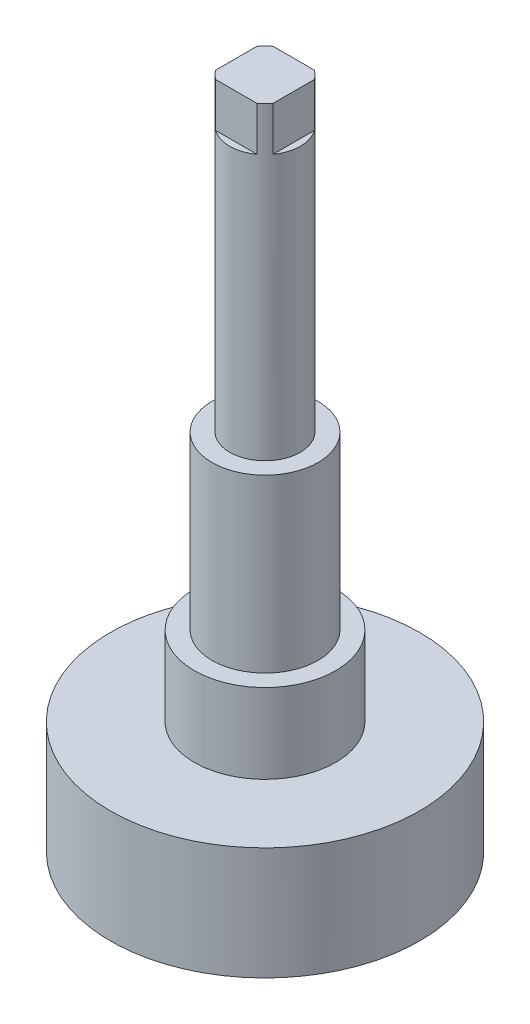
ISO-10303-21;
HEADER;
FILE_DESCRIPTION(('STEP AP214'),'2;1');
FILE_NAME('part.step','',(''),(''),'','','');
FILE_SCHEMA(('AUTOMOTIVE_DESIGN { 1 0 10303 214 1 1 1 1 }'));
ENDSEC;
DATA;
#1=APPLICATION_CONTEXT('core data for automotive mechanical design processes');
#2=APPLICATION_PROTOCOL_DEFINITION('international standard','automotive_design',2000,#1);
#3=PRODUCT_CONTEXT('',#1,'mechanical');
#4=PRODUCT('Part','Part','',(#3));
#5=PRODUCT_RELATED_PRODUCT_CATEGORY('part','',(#4));
#6=PRODUCT_DEFINITION_FORMATION('','',#4);
#7=PRODUCT_DEFINITION_CONTEXT('part definition',#1,'design');
#8=PRODUCT_DEFINITION('design','',#6,#7);
#9=PRODUCT_DEFINITION_SHAPE('','',#8);
#10=(LENGTH_UNIT() NAMED_UNIT(*) SI_UNIT(.MILLI.,.METRE.));
#11=(NAMED_UNIT(*) PLANE_ANGLE_UNIT() SI_UNIT($,.RADIAN.));
#12=(NAMED_UNIT(*) SI_UNIT($,.STERADIAN.) SOLID_ANGLE_UNIT());
#13=UNCERTAINTY_MEASURE_WITH_UNIT(LENGTH_MEASURE(1.E-05),#10,'distance_accuracy_value','');
#14=(GEOMETRIC_REPRESENTATION_CONTEXT(3) GLOBAL_UNCERTAINTY_ASSIGNED_CONTEXT((#13)) GLOBAL_UNIT_ASSIGNED_CONTEXT((#10,
#11,#12)) REPRESENTATION_CONTEXT('',''));
#15=CARTESIAN_POINT('',(0.,0.,0.));
#16=DIRECTION('',(0.,0.,1.));
#17=DIRECTION('',(1.,0.,0.));
#18=AXIS2_PLACEMENT_3D('',#15,#16,#17);
#19=CARTESIAN_POINT('',(0.,63.4,0.));
#20=DIRECTION('',(0.,1.,0.));
#21=DIRECTION('',(0.,0.,1.));
#22=AXIS2_PLACEMENT_3D('',#19,#20,#21);
#23=PLANE('',#22);
#24=DIRECTION('',(-1.,0.,0.));
#25=VECTOR('',#24,1.);
#26=CARTESIAN_POINT('',(2.3318447632722,63.4,-3.25));
#27=LINE('',#26,#25);
#28=CARTESIAN_POINT('',(2.3318447632722,63.4,-3.25));
#29=VERTEX_POINT('',#28);
#30=CARTESIAN_POINT('',(-2.3318447632722,63.4,-3.25));
#31=VERTEX_POINT('',#30);
#32=EDGE_CURVE('E120',#29,#31,#27,.T.);
#33=ORIENTED_EDGE('',*,*,#32,.F.);
#34=CARTESIAN_POINT('',(0.,63.4,0.));
#35=DIRECTION('',(0.,1.,0.));
#36=DIRECTION('',(0.,0.,1.));
#37=AXIS2_PLACEMENT_3D('',#34,#35,#36);
#38=CIRCLE('',#37,4.);
#39=EDGE_CURVE('E361',#29,#31,#38,.T.);
#40=ORIENTED_EDGE('',*,*,#39,.T.);
#41=EDGE_LOOP('',(#33,#40));
#42=FACE_BOUND('',#41,.T.);
#43=ADVANCED_FACE('F34',(#42),#23,.T.);
#44=DIRECTION('',(0.,0.,-1.));
#45=VECTOR('',#44,1.);
#46=CARTESIAN_POINT('',(3.25,63.4,2.3318447632722));
#47=LINE('',#46,#45);
#48=CARTESIAN_POINT('',(3.25,63.4,2.3318447632722));
#49=VERTEX_POINT('',#48);
#50=CARTESIAN_POINT('',(3.25,63.4,-2.3318447632722));
#51=VERTEX_POINT('',#50);
#52=EDGE_CURVE('E359',#49,#51,#47,.T.);
#53=ORIENTED_EDGE('',*,*,#52,.F.);
#54=EDGE_CURVE('E143',#49,#51,#38,.T.);
#55=ORIENTED_EDGE('',*,*,#54,.T.);
#56=EDGE_LOOP('',(#53,#55));
#57=FACE_BOUND('',#56,.T.);
#58=ADVANCED_FACE('F174',(#57),#23,.T.);
#59=DIRECTION('',(1.,0.,0.));
#60=VECTOR('',#59,1.);
#61=CARTESIAN_POINT('',(-2.3318447632722,63.4,3.25));
#62=LINE('',#61,#60);
#63=CARTESIAN_POINT('',(-2.3318447632722,63.4,3.25));
#64=VERTEX_POINT('',#63);
#65=CARTESIAN_POINT('',(2.3318447632722,63.4,3.25));
#66=VERTEX_POINT('',#65);
#67=EDGE_CURVE('E50',#64,#66,#62,.T.);
#68=ORIENTED_EDGE('',*,*,#67,.F.);
#69=EDGE_CURVE('E137',#64,#66,#38,.T.);
#70=ORIENTED_EDGE('',*,*,#69,.T.);
#71=EDGE_LOOP('',(#68,#70));
#72=FACE_BOUND('',#71,.T.);
#73=ADVANCED_FACE('F181',(#72),#23,.T.);
#74=CARTESIAN_POINT('',(0.,5.,0.));
#75=DIRECTION('',(0.,1.,0.));
#76=DIRECTION('',(0.,0.,1.));
#77=AXIS2_PLACEMENT_3D('',#74,#75,#76);
#78=PLANE('',#77);
#79=CARTESIAN_POINT('',(0.,5.,0.));
#80=DIRECTION('',(0.,1.,0.));
#81=DIRECTION('',(0.,0.,1.));
#82=AXIS2_PLACEMENT_3D('',#79,#80,#81);
#83=CIRCLE('',#82,17.5);
#84=CARTESIAN_POINT('',(0.,5.,17.5));
#85=VERTEX_POINT('',#84);
#86=EDGE_CURVE('E154',#85,#85,#83,.T.);
#87=ORIENTED_EDGE('',*,*,#86,.T.);
#88=EDGE_LOOP('',(#87));
#89=FACE_BOUND('',#88,.T.);
#90=CARTESIAN_POINT('',(0.,5.,0.));
#91=DIRECTION('',(0.,1.,0.));
#92=DIRECTION('',(0.,0.,1.));
#93=AXIS2_PLACEMENT_3D('',#90,#91,#92);
#94=CIRCLE('',#93,8.);
#95=CARTESIAN_POINT('',(0.,5.,8.));
#96=VERTEX_POINT('',#95);
#97=EDGE_CURVE('E128',#96,#96,#94,.T.);
#98=ORIENTED_EDGE('',*,*,#97,.F.);
#99=EDGE_LOOP('',(#98));
#100=FACE_BOUND('',#99,.T.);
#101=ADVANCED_FACE('F171',(#89,#100),#78,.T.);
#102=CARTESIAN_POINT('',(0.,0.,0.));
#103=DIRECTION('',(0.,1.,0.));
#104=DIRECTION('',(0.,0.,1.));
#105=AXIS2_PLACEMENT_3D('',#102,#103,#104);
#106=PLANE('',#105);
#107=CARTESIAN_POINT('',(0.,0.,0.));
#108=DIRECTION('',(0.,1.,0.));
#109=DIRECTION('',(0.,0.,1.));
#110=AXIS2_PLACEMENT_3D('',#107,#108,#109);
#111=CIRCLE('',#110,5.);
#112=CARTESIAN_POINT('',(0.,0.,5.));
#113=VERTEX_POINT('',#112);
#114=EDGE_CURVE('E43',#113,#113,#111,.T.);
#115=ORIENTED_EDGE('',*,*,#114,.T.);
#116=EDGE_LOOP('',(#115));
#117=FACE_BOUND('',#116,.T.);
#118=CARTESIAN_POINT('',(0.,0.,0.));
#119=DIRECTION('',(0.,-1.,0.));
#120=DIRECTION('',(0.,0.,-1.));
#121=AXIS2_PLACEMENT_3D('',#118,#119,#120);
#122=CIRCLE('',#121,13.5);
#123=CARTESIAN_POINT('',(0.,0.,-13.5));
#124=VERTEX_POINT('',#123);
#125=EDGE_CURVE('E149',#124,#124,#122,.T.);
#126=ORIENTED_EDGE('',*,*,#125,.T.);
#127=EDGE_LOOP('',(#126));
#128=FACE_BOUND('',#127,.T.);
#129=ADVANCED_FACE('F159',(#117,#128),#106,.F.);
#130=CARTESIAN_POINT('',(0.,-8.,0.));
#131=DIRECTION('',(0.,1.,0.));
#132=DIRECTION('',(0.,0.,1.));
#133=AXIS2_PLACEMENT_3D('',#130,#131,#132);
#134=CYLINDRICAL_SURFACE('',#133,5.);
#135=CARTESIAN_POINT('',(0.,-8.,0.));
#136=DIRECTION('',(0.,1.,0.));
#137=DIRECTION('',(0.,0.,1.));
#138=AXIS2_PLACEMENT_3D('',#135,#136,#137);
#139=CIRCLE('',#138,5.);
#140=CARTESIAN_POINT('',(0.,-8.,5.));
#141=VERTEX_POINT('',#140);
#142=EDGE_CURVE('E11',#141,#141,#139,.T.);
#143=ORIENTED_EDGE('',*,*,#142,.T.);
#144=EDGE_LOOP('',(#143));
#145=FACE_BOUND('',#144,.T.);
#146=ORIENTED_EDGE('',*,*,#114,.F.);
#147=EDGE_LOOP('',(#146));
#148=FACE_BOUND('',#147,.T.);
#149=ADVANCED_FACE('F36',(#145,#148),#134,.T.);
#150=CARTESIAN_POINT('',(0.,-8.,0.));
#151=DIRECTION('',(0.,1.,0.));
#152=DIRECTION('',(0.,0.,1.));
#153=AXIS2_PLACEMENT_3D('',#150,#151,#152);
#154=PLANE('',#153);
#155=ORIENTED_EDGE('',*,*,#142,.F.);
#156=EDGE_LOOP('',(#155));
#157=FACE_BOUND('',#156,.T.);
#158=ADVANCED_FACE('F163',(#157),#154,.F.);
#159=CARTESIAN_POINT('',(0.,-7.75,0.));
#160=DIRECTION('',(0.,-1.,0.));
#161=DIRECTION('',(0.,0.,-1.));
#162=AXIS2_PLACEMENT_3D('',#159,#160,#161);
#163=PLANE('',#162);
#164=CARTESIAN_POINT('',(0.,-7.75,0.));
#165=DIRECTION('',(0.,-1.,0.));
#166=DIRECTION('',(0.,0.,-1.));
#167=AXIS2_PLACEMENT_3D('',#164,#165,#166);
#168=CIRCLE('',#167,17.5);
#169=CARTESIAN_POINT('',(0.,-7.75,-17.5));
#170=VERTEX_POINT('',#169);
#171=EDGE_CURVE('E148',#170,#170,#168,.T.);
#172=ORIENTED_EDGE('',*,*,#171,.T.);
#173=EDGE_LOOP('',(#172));
#174=FACE_BOUND('',#173,.T.);
#175=CARTESIAN_POINT('',(0.,-7.75,0.));
#176=DIRECTION('',(0.,-1.,0.));
#177=DIRECTION('',(0.,0.,-1.));
#178=AXIS2_PLACEMENT_3D('',#175,#176,#177);
#179=CIRCLE('',#178,13.5);
#180=CARTESIAN_POINT('',(0.,-7.75,-13.5));
#181=VERTEX_POINT('',#180);
#182=EDGE_CURVE('E145',#181,#181,#179,.T.);
#183=ORIENTED_EDGE('',*,*,#182,.F.);
#184=EDGE_LOOP('',(#183));
#185=FACE_BOUND('',#184,.T.);
#186=ADVANCED_FACE('F169',(#174,#185),#163,.T.);
#187=CARTESIAN_POINT('',(0.,-7.75,0.));
#188=DIRECTION('',(0.,1.,0.));
#189=DIRECTION('',(0.,0.,1.));
#190=AXIS2_PLACEMENT_3D('',#187,#188,#189);
#191=CYLINDRICAL_SURFACE('',#190,13.5);
#192=ORIENTED_EDGE('',*,*,#182,.T.);
#193=EDGE_LOOP('',(#192));
#194=FACE_BOUND('',#193,.T.);
#195=ORIENTED_EDGE('',*,*,#125,.F.);
#196=EDGE_LOOP('',(#195));
#197=FACE_BOUND('',#196,.T.);
#198=ADVANCED_FACE('F211',(#194,#197),#191,.F.);
#199=CARTESIAN_POINT('',(0.,5.,0.));
#200=DIRECTION('',(0.,-1.,0.));
#201=DIRECTION('',(0.,0.,-1.));
#202=AXIS2_PLACEMENT_3D('',#199,#200,#201);
#203=CYLINDRICAL_SURFACE('',#202,17.5);
#204=ORIENTED_EDGE('',*,*,#86,.F.);
#205=EDGE_LOOP('',(#204));
#206=FACE_BOUND('',#205,.T.);
#207=ORIENTED_EDGE('',*,*,#171,.F.);
#208=EDGE_LOOP('',(#207));
#209=FACE_BOUND('',#208,.T.);
#210=ADVANCED_FACE('F209',(#206,#209),#203,.T.);
#211=CARTESIAN_POINT('',(0.,14.,0.));
#212=DIRECTION('',(0.,1.,0.));
#213=DIRECTION('',(0.,0.,1.));
#214=AXIS2_PLACEMENT_3D('',#211,#212,#213);
#215=PLANE('',#214);
#216=CARTESIAN_POINT('',(0.,14.,0.));
#217=DIRECTION('',(0.,1.,0.));
#218=DIRECTION('',(0.,0.,1.));
#219=AXIS2_PLACEMENT_3D('',#216,#217,#218);
#220=CIRCLE('',#219,8.);
#221=CARTESIAN_POINT('',(0.,14.,8.));
#222=VERTEX_POINT('',#221);
#223=EDGE_CURVE('E134',#222,#222,#220,.T.);
#224=ORIENTED_EDGE('',*,*,#223,.T.);
#225=EDGE_LOOP('',(#224));
#226=FACE_BOUND('',#225,.T.);
#227=CARTESIAN_POINT('',(0.,14.,0.));
#228=DIRECTION('',(0.,1.,0.));
#229=DIRECTION('',(0.,0.,1.));
#230=AXIS2_PLACEMENT_3D('',#227,#228,#229);
#231=CIRCLE('',#230,6.);
#232=CARTESIAN_POINT('',(0.,14.,6.));
#233=VERTEX_POINT('',#232);
#234=EDGE_CURVE('E125',#233,#233,#231,.T.);
#235=ORIENTED_EDGE('',*,*,#234,.F.);
#236=EDGE_LOOP('',(#235));
#237=FACE_BOUND('',#236,.T.);
#238=ADVANCED_FACE('F194',(#226,#237),#215,.T.);
#239=CARTESIAN_POINT('',(0.,14.,0.));
#240=DIRECTION('',(0.,-1.,0.));
#241=DIRECTION('',(0.,0.,-1.));
#242=AXIS2_PLACEMENT_3D('',#239,#240,#241);
#243=CYLINDRICAL_SURFACE('',#242,8.);
#244=ORIENTED_EDGE('',*,*,#223,.F.);
#245=EDGE_LOOP('',(#244));
#246=FACE_BOUND('',#245,.T.);
#247=ORIENTED_EDGE('',*,*,#97,.T.);
#248=EDGE_LOOP('',(#247));
#249=FACE_BOUND('',#248,.T.);
#250=ADVANCED_FACE('F186',(#246,#249),#243,.T.);
#251=DIRECTION('',(0.,0.,1.));
#252=VECTOR('',#251,1.);
#253=CARTESIAN_POINT('',(-3.25,63.4,-2.3318447632722));
#254=LINE('',#253,#252);
#255=CARTESIAN_POINT('',(-3.25,63.4,-2.3318447632722));
#256=VERTEX_POINT('',#255);
#257=CARTESIAN_POINT('',(-3.25,63.4,2.3318447632722));
#258=VERTEX_POINT('',#257);
#259=EDGE_CURVE('E57',#256,#258,#254,.T.);
#260=ORIENTED_EDGE('',*,*,#259,.F.);
#261=EDGE_CURVE('E124',#256,#258,#38,.T.);
#262=ORIENTED_EDGE('',*,*,#261,.T.);
#263=EDGE_LOOP('',(#260,#262));
#264=FACE_BOUND('',#263,.T.);
#265=ADVANCED_FACE('F177',(#264),#23,.T.);
#266=CARTESIAN_POINT('',(0.,33.4,0.));
#267=DIRECTION('',(0.,1.,0.));
#268=DIRECTION('',(0.,0.,1.));
#269=AXIS2_PLACEMENT_3D('',#266,#267,#268);
#270=CYLINDRICAL_SURFACE('',#269,4.);
#271=CARTESIAN_POINT('',(0.,33.4,0.));
#272=DIRECTION('',(0.,1.,0.));
#273=DIRECTION('',(0.,0.,1.));
#274=AXIS2_PLACEMENT_3D('',#271,#272,#273);
#275=CIRCLE('',#274,4.);
#276=CARTESIAN_POINT('',(0.,33.4,4.));
#277=VERTEX_POINT('',#276);
#278=EDGE_CURVE('E140',#277,#277,#275,.T.);
#279=ORIENTED_EDGE('',*,*,#278,.T.);
#280=EDGE_LOOP('',(#279));
#281=FACE_BOUND('',#280,.T.);
#282=ORIENTED_EDGE('',*,*,#54,.F.);
#283=DIRECTION('',(0.,-1.,0.));
#284=VECTOR('',#283,1.);
#285=CARTESIAN_POINT('',(3.25,68.4,2.3318447632722));
#286=LINE('',#285,#284);
#287=CARTESIAN_POINT('',(3.25,68.4,2.3318447632722));
#288=VERTEX_POINT('',#287);
#289=EDGE_CURVE('E371',#288,#49,#286,.T.);
#290=ORIENTED_EDGE('',*,*,#289,.F.);
#291=CARTESIAN_POINT('',(0.,68.4,0.));
#292=DIRECTION('',(0.,1.,0.));
#293=DIRECTION('',(0.,0.,1.));
#294=AXIS2_PLACEMENT_3D('',#291,#292,#293);
#295=CIRCLE('',#294,4.);
#296=CARTESIAN_POINT('',(2.3318447632722,68.4,3.25));
#297=VERTEX_POINT('',#296);
#298=EDGE_CURVE('E383',#297,#288,#295,.T.);
#299=ORIENTED_EDGE('',*,*,#298,.F.);
#300=DIRECTION('',(0.,-1.,0.));
#301=VECTOR('',#300,1.);
#302=CARTESIAN_POINT('',(2.3318447632722,68.4,3.25));
#303=LINE('',#302,#301);
#304=EDGE_CURVE('E374',#297,#66,#303,.T.);
#305=ORIENTED_EDGE('',*,*,#304,.T.);
#306=ORIENTED_EDGE('',*,*,#69,.F.);
#307=DIRECTION('',(0.,-1.,0.));
#308=VECTOR('',#307,1.);
#309=CARTESIAN_POINT('',(-2.33184476327221,68.4,3.25));
#310=LINE('',#309,#308);
#311=CARTESIAN_POINT('',(-2.33184476327221,68.4,3.25));
#312=VERTEX_POINT('',#311);
#313=EDGE_CURVE('E130',#312,#64,#310,.T.);
#314=ORIENTED_EDGE('',*,*,#313,.F.);
#315=CARTESIAN_POINT('',(0.,68.4,0.));
#316=DIRECTION('',(0.,1.,0.));
#317=DIRECTION('',(0.,0.,1.));
#318=AXIS2_PLACEMENT_3D('',#315,#316,#317);
#319=CIRCLE('',#318,4.);
#320=CARTESIAN_POINT('',(-3.25,68.4,2.3318447632722));
#321=VERTEX_POINT('',#320);
#322=EDGE_CURVE('E110',#321,#312,#319,.T.);
#323=ORIENTED_EDGE('',*,*,#322,.F.);
#324=DIRECTION('',(0.,-1.,0.));
#325=VECTOR('',#324,1.);
#326=CARTESIAN_POINT('',(-3.25,68.4,2.3318447632722));
#327=LINE('',#326,#325);
#328=EDGE_CURVE('E107',#321,#258,#327,.T.);
#329=ORIENTED_EDGE('',*,*,#328,.T.);
#330=ORIENTED_EDGE('',*,*,#261,.F.);
#331=DIRECTION('',(0.,-1.,0.));
#332=VECTOR('',#331,1.);
#333=CARTESIAN_POINT('',(-3.25,68.4,-2.3318447632722));
#334=LINE('',#333,#332);
#335=CARTESIAN_POINT('',(-3.25,68.4,-2.3318447632722));
#336=VERTEX_POINT('',#335);
#337=EDGE_CURVE('E105',#336,#256,#334,.T.);
#338=ORIENTED_EDGE('',*,*,#337,.F.);
#339=CARTESIAN_POINT('',(0.,68.4,0.));
#340=DIRECTION('',(0.,1.,0.));
#341=DIRECTION('',(0.,0.,1.));
#342=AXIS2_PLACEMENT_3D('',#339,#340,#341);
#343=CIRCLE('',#342,4.);
#344=CARTESIAN_POINT('',(-2.3318447632722,68.4,-3.25));
#345=VERTEX_POINT('',#344);
#346=EDGE_CURVE('E111',#345,#336,#343,.T.);
#347=ORIENTED_EDGE('',*,*,#346,.F.);
#348=DIRECTION('',(0.,-1.,0.));
#349=VECTOR('',#348,1.);
#350=CARTESIAN_POINT('',(-2.3318447632722,68.4,-3.25));
#351=LINE('',#350,#349);
#352=EDGE_CURVE('E355',#345,#31,#351,.T.);
#353=ORIENTED_EDGE('',*,*,#352,.T.);
#354=ORIENTED_EDGE('',*,*,#39,.F.);
#355=DIRECTION('',(0.,-1.,0.));
#356=VECTOR('',#355,1.);
#357=CARTESIAN_POINT('',(2.3318447632722,68.4,-3.25));
#358=LINE('',#357,#356);
#359=CARTESIAN_POINT('',(2.3318447632722,68.4,-3.25));
#360=VERTEX_POINT('',#359);
#361=EDGE_CURVE('E357',#360,#29,#358,.T.);
#362=ORIENTED_EDGE('',*,*,#361,.F.);
#363=CARTESIAN_POINT('',(0.,68.4,0.));
#364=DIRECTION('',(0.,1.,0.));
#365=DIRECTION('',(0.,0.,1.));
#366=AXIS2_PLACEMENT_3D('',#363,#364,#365);
#367=CIRCLE('',#366,4.);
#368=CARTESIAN_POINT('',(3.25,68.4,-2.3318447632722));
#369=VERTEX_POINT('',#368);
#370=EDGE_CURVE('E365',#369,#360,#367,.T.);
#371=ORIENTED_EDGE('',*,*,#370,.F.);
#372=DIRECTION('',(0.,-1.,0.));
#373=VECTOR('',#372,1.);
#374=CARTESIAN_POINT('',(3.25,68.4,-2.3318447632722));
#375=LINE('',#374,#373);
#376=EDGE_CURVE('E363',#369,#51,#375,.T.);
#377=ORIENTED_EDGE('',*,*,#376,.T.);
#378=EDGE_LOOP('',(#282,#290,#299,#305,#306,#314,#323,#329,#330,#338,#347,#353,#354,#362,#371,#377));
#379=FACE_BOUND('',#378,.T.);
#380=ADVANCED_FACE('F123',(#281,#379),#270,.T.);
#381=CARTESIAN_POINT('',(0.,33.4,0.));
#382=DIRECTION('',(0.,1.,0.));
#383=DIRECTION('',(0.,0.,1.));
#384=AXIS2_PLACEMENT_3D('',#381,#382,#383);
#385=PLANE('',#384);
#386=ORIENTED_EDGE('',*,*,#278,.F.);
#387=EDGE_LOOP('',(#386));
#388=FACE_BOUND('',#387,.T.);
#389=CARTESIAN_POINT('',(0.,33.4,0.));
#390=DIRECTION('',(0.,1.,0.));
#391=DIRECTION('',(0.,0.,1.));
#392=AXIS2_PLACEMENT_3D('',#389,#390,#391);
#393=CIRCLE('',#392,6.);
#394=CARTESIAN_POINT('',(0.,33.4,6.));
#395=VERTEX_POINT('',#394);
#396=EDGE_CURVE('E38',#395,#395,#393,.T.);
#397=ORIENTED_EDGE('',*,*,#396,.T.);
#398=EDGE_LOOP('',(#397));
#399=FACE_BOUND('',#398,.T.);
#400=ADVANCED_FACE('F191',(#388,#399),#385,.T.);
#401=CARTESIAN_POINT('',(0.,63.4,0.));
#402=DIRECTION('',(0.,-1.,0.));
#403=DIRECTION('',(0.,0.,-1.));
#404=AXIS2_PLACEMENT_3D('',#401,#402,#403);
#405=CYLINDRICAL_SURFACE('',#404,6.);
#406=ORIENTED_EDGE('',*,*,#234,.T.);
#407=EDGE_LOOP('',(#406));
#408=FACE_BOUND('',#407,.T.);
#409=ORIENTED_EDGE('',*,*,#396,.F.);
#410=EDGE_LOOP('',(#409));
#411=FACE_BOUND('',#410,.T.);
#412=ADVANCED_FACE('F252',(#408,#411),#405,.T.);
#413=CARTESIAN_POINT('',(-3.25,68.4,-2.3318447632722));
#414=DIRECTION('',(1.,0.,0.));
#415=DIRECTION('',(0.,0.,-1.));
#416=AXIS2_PLACEMENT_3D('',#413,#414,#415);
#417=PLANE('',#416);
#418=ORIENTED_EDGE('',*,*,#259,.T.);
#419=ORIENTED_EDGE('',*,*,#328,.F.);
#420=DIRECTION('',(0.,0.,1.));
#421=VECTOR('',#420,1.);
#422=CARTESIAN_POINT('',(-3.25,68.4,-2.3318447632722));
#423=LINE('',#422,#421);
#424=EDGE_CURVE('E101',#336,#321,#423,.T.);
#425=ORIENTED_EDGE('',*,*,#424,.F.);
#426=ORIENTED_EDGE('',*,*,#337,.T.);
#427=EDGE_LOOP('',(#418,#419,#425,#426));
#428=FACE_BOUND('',#427,.T.);
#429=ADVANCED_FACE('F103',(#428),#417,.F.);
#430=CARTESIAN_POINT('',(-2.3318447632722,68.4,3.25));
#431=DIRECTION('',(0.,0.,-1.));
#432=DIRECTION('',(-1.,0.,0.));
#433=AXIS2_PLACEMENT_3D('',#430,#431,#432);
#434=PLANE('',#433);
#435=ORIENTED_EDGE('',*,*,#67,.T.);
#436=ORIENTED_EDGE('',*,*,#304,.F.);
#437=DIRECTION('',(1.,0.,0.));
#438=VECTOR('',#437,1.);
#439=CARTESIAN_POINT('',(-2.3318447632722,68.4,3.25));
#440=LINE('',#439,#438);
#441=EDGE_CURVE('E380',#312,#297,#440,.T.);
#442=ORIENTED_EDGE('',*,*,#441,.F.);
#443=ORIENTED_EDGE('',*,*,#313,.T.);
#444=EDGE_LOOP('',(#435,#436,#442,#443));
#445=FACE_BOUND('',#444,.T.);
#446=ADVANCED_FACE('F312',(#445),#434,.F.);
#447=CARTESIAN_POINT('',(3.25,68.4,2.3318447632722));
#448=DIRECTION('',(-1.,0.,0.));
#449=DIRECTION('',(0.,0.,1.));
#450=AXIS2_PLACEMENT_3D('',#447,#448,#449);
#451=PLANE('',#450);
#452=ORIENTED_EDGE('',*,*,#52,.T.);
#453=ORIENTED_EDGE('',*,*,#376,.F.);
#454=DIRECTION('',(0.,0.,-1.));
#455=VECTOR('',#454,1.);
#456=CARTESIAN_POINT('',(3.25,68.4,2.3318447632722));
#457=LINE('',#456,#455);
#458=EDGE_CURVE('E385',#288,#369,#457,.T.);
#459=ORIENTED_EDGE('',*,*,#458,.F.);
#460=ORIENTED_EDGE('',*,*,#289,.T.);
#461=EDGE_LOOP('',(#452,#453,#459,#460));
#462=FACE_BOUND('',#461,.T.);
#463=ADVANCED_FACE('F321',(#462),#451,.F.);
#464=CARTESIAN_POINT('',(2.3318447632722,68.4,-3.25));
#465=DIRECTION('',(0.,0.,1.));
#466=DIRECTION('',(1.,0.,0.));
#467=AXIS2_PLACEMENT_3D('',#464,#465,#466);
#468=PLANE('',#467);
#469=ORIENTED_EDGE('',*,*,#32,.T.);
#470=ORIENTED_EDGE('',*,*,#352,.F.);
#471=DIRECTION('',(-1.,0.,0.));
#472=VECTOR('',#471,1.);
#473=CARTESIAN_POINT('',(2.3318447632722,68.4,-3.25));
#474=LINE('',#473,#472);
#475=EDGE_CURVE('E116',#360,#345,#474,.T.);
#476=ORIENTED_EDGE('',*,*,#475,.F.);
#477=ORIENTED_EDGE('',*,*,#361,.T.);
#478=EDGE_LOOP('',(#469,#470,#476,#477));
#479=FACE_BOUND('',#478,.T.);
#480=ADVANCED_FACE('F331',(#479),#468,.F.);
#481=CARTESIAN_POINT('',(0.,68.4,0.));
#482=DIRECTION('',(0.,1.,0.));
#483=DIRECTION('',(0.,0.,1.));
#484=AXIS2_PLACEMENT_3D('',#481,#482,#483);
#485=PLANE('',#484);
#486=ORIENTED_EDGE('',*,*,#346,.T.);
#487=ORIENTED_EDGE('',*,*,#424,.T.);
#488=ORIENTED_EDGE('',*,*,#322,.T.);
#489=ORIENTED_EDGE('',*,*,#441,.T.);
#490=ORIENTED_EDGE('',*,*,#298,.T.);
#491=ORIENTED_EDGE('',*,*,#458,.T.);
#492=ORIENTED_EDGE('',*,*,#370,.T.);
#493=ORIENTED_EDGE('',*,*,#475,.T.);
#494=EDGE_LOOP('',(#486,#487,#488,#489,#490,#491,#492,#493));
#495=FACE_BOUND('',#494,.T.);
#496=ADVANCED_FACE('F114',(#495),#485,.T.);
#497=CLOSED_SHELL('',(#43,#58,#73,#101,#129,#149,#158,#186,#198,#210,#238,#250,#265,#380,#400,
#412,#429,#446,#463,#480,#496));
#498=MANIFOLD_SOLID_BREP('B2',#497);
#499=ADVANCED_BREP_SHAPE_REPRESENTATION('',(#18,#498),#14);
#500=SHAPE_DEFINITION_REPRESENTATION(#9,#499);
ENDSEC;
END-ISO-10303-21;
